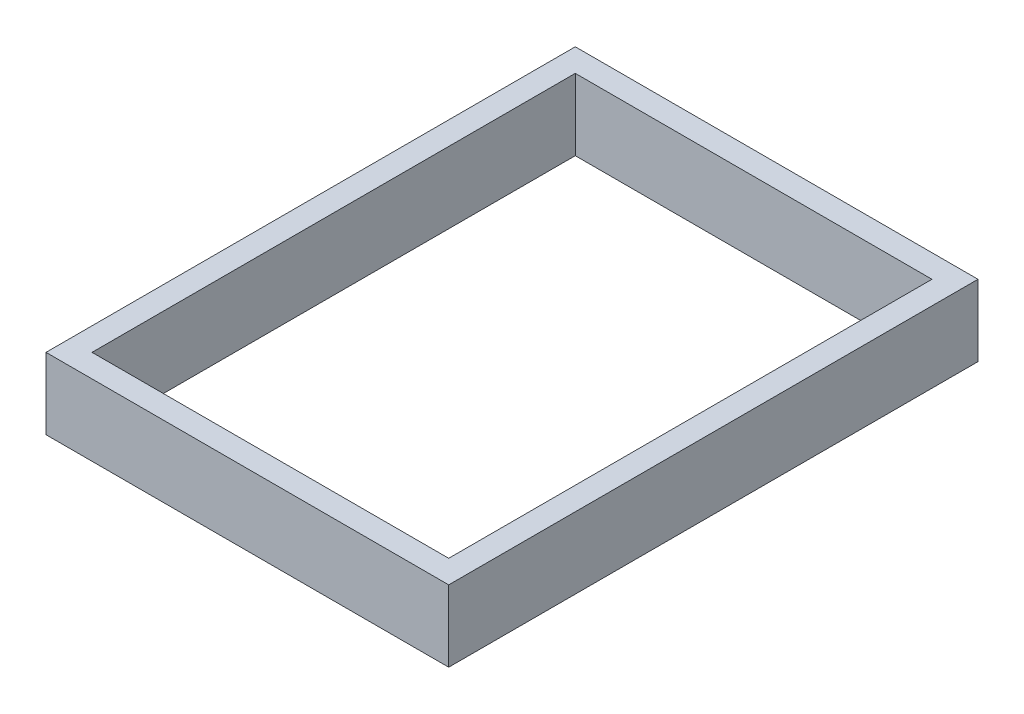
ISO-10303-21;
HEADER;
FILE_DESCRIPTION(('STEP AP214'),'2;1');
FILE_NAME('part.step','',(''),(''),'','','');
FILE_SCHEMA(('AUTOMOTIVE_DESIGN { 1 0 10303 214 1 1 1 1 }'));
ENDSEC;
DATA;
#1=APPLICATION_CONTEXT('core data for automotive mechanical design processes');
#2=APPLICATION_PROTOCOL_DEFINITION('international standard','automotive_design',2000,#1);
#3=PRODUCT_CONTEXT('',#1,'mechanical');
#4=PRODUCT('Part','Part','',(#3));
#5=PRODUCT_RELATED_PRODUCT_CATEGORY('part','',(#4));
#6=PRODUCT_DEFINITION_FORMATION('','',#4);
#7=PRODUCT_DEFINITION_CONTEXT('part definition',#1,'design');
#8=PRODUCT_DEFINITION('design','',#6,#7);
#9=PRODUCT_DEFINITION_SHAPE('','',#8);
#10=(LENGTH_UNIT() NAMED_UNIT(*) SI_UNIT(.MILLI.,.METRE.));
#11=(NAMED_UNIT(*) PLANE_ANGLE_UNIT() SI_UNIT($,.RADIAN.));
#12=(NAMED_UNIT(*) SI_UNIT($,.STERADIAN.) SOLID_ANGLE_UNIT());
#13=UNCERTAINTY_MEASURE_WITH_UNIT(LENGTH_MEASURE(1.E-05),#10,'distance_accuracy_value','');
#14=(GEOMETRIC_REPRESENTATION_CONTEXT(3) GLOBAL_UNCERTAINTY_ASSIGNED_CONTEXT((#13)) GLOBAL_UNIT_ASSIGNED_CONTEXT((#10,
#11,#12)) REPRESENTATION_CONTEXT('',''));
#15=CARTESIAN_POINT('',(0.,0.,0.));
#16=DIRECTION('',(0.,0.,1.));
#17=DIRECTION('',(1.,0.,0.));
#18=AXIS2_PLACEMENT_3D('',#15,#16,#17);
#19=CARTESIAN_POINT('',(0.,62.,-20.));
#20=DIRECTION('',(0.,0.,-1.));
#21=DIRECTION('',(-1.,0.,0.));
#22=AXIS2_PLACEMENT_3D('',#19,#20,#21);
#23=PLANE('',#22);
#24=DIRECTION('',(1.,0.,0.));
#25=VECTOR('',#24,1.);
#26=CARTESIAN_POINT('',(0.,0.,-20.));
#27=LINE('',#26,#25);
#28=CARTESIAN_POINT('',(20.,0.,-20.));
#29=VERTEX_POINT('',#28);
#30=CARTESIAN_POINT('',(330.,0.,-20.));
#31=VERTEX_POINT('',#30);
#32=EDGE_CURVE('E149',#29,#31,#27,.T.);
#33=ORIENTED_EDGE('',*,*,#32,.F.);
#34=DIRECTION('',(0.,-1.,0.));
#35=VECTOR('',#34,1.);
#36=CARTESIAN_POINT('',(20.,62.,-20.));
#37=LINE('',#36,#35);
#38=CARTESIAN_POINT('',(20.,62.,-20.));
#39=VERTEX_POINT('',#38);
#40=EDGE_CURVE('E11',#39,#29,#37,.T.);
#41=ORIENTED_EDGE('',*,*,#40,.F.);
#42=DIRECTION('',(1.,0.,0.));
#43=VECTOR('',#42,1.);
#44=CARTESIAN_POINT('',(0.,62.,-20.));
#45=LINE('',#44,#43);
#46=CARTESIAN_POINT('',(330.,62.,-20.));
#47=VERTEX_POINT('',#46);
#48=EDGE_CURVE('E122',#39,#47,#45,.T.);
#49=ORIENTED_EDGE('',*,*,#48,.T.);
#50=DIRECTION('',(0.,-1.,0.));
#51=VECTOR('',#50,1.);
#52=CARTESIAN_POINT('',(330.,62.,-20.));
#53=LINE('',#52,#51);
#54=EDGE_CURVE('E88',#47,#31,#53,.T.);
#55=ORIENTED_EDGE('',*,*,#54,.T.);
#56=EDGE_LOOP('',(#33,#41,#49,#55));
#57=FACE_BOUND('',#56,.T.);
#58=ADVANCED_FACE('F35',(#57),#23,.T.);
#59=CARTESIAN_POINT('',(20.,62.,0.));
#60=DIRECTION('',(-1.,0.,0.));
#61=DIRECTION('',(0.,0.,1.));
#62=AXIS2_PLACEMENT_3D('',#59,#60,#61);
#63=PLANE('',#62);
#64=DIRECTION('',(0.,0.,-1.));
#65=VECTOR('',#64,1.);
#66=CARTESIAN_POINT('',(20.,0.,0.));
#67=LINE('',#66,#65);
#68=CARTESIAN_POINT('',(20.,0.,-440.));
#69=VERTEX_POINT('',#68);
#70=EDGE_CURVE('E127',#29,#69,#67,.T.);
#71=ORIENTED_EDGE('',*,*,#70,.T.);
#72=DIRECTION('',(0.,-1.,0.));
#73=VECTOR('',#72,1.);
#74=CARTESIAN_POINT('',(20.,62.,-440.));
#75=LINE('',#74,#73);
#76=CARTESIAN_POINT('',(20.,62.,-440.));
#77=VERTEX_POINT('',#76);
#78=EDGE_CURVE('E45',#77,#69,#75,.T.);
#79=ORIENTED_EDGE('',*,*,#78,.F.);
#80=DIRECTION('',(0.,0.,-1.));
#81=VECTOR('',#80,1.);
#82=CARTESIAN_POINT('',(20.,62.,0.));
#83=LINE('',#82,#81);
#84=EDGE_CURVE('E118',#39,#77,#83,.T.);
#85=ORIENTED_EDGE('',*,*,#84,.F.);
#86=ORIENTED_EDGE('',*,*,#40,.T.);
#87=EDGE_LOOP('',(#71,#79,#85,#86));
#88=FACE_BOUND('',#87,.T.);
#89=ADVANCED_FACE('F125',(#88),#63,.F.);
#90=CARTESIAN_POINT('',(0.,62.,-440.));
#91=DIRECTION('',(0.,0.,-1.));
#92=DIRECTION('',(-1.,0.,0.));
#93=AXIS2_PLACEMENT_3D('',#90,#91,#92);
#94=PLANE('',#93);
#95=DIRECTION('',(1.,0.,0.));
#96=VECTOR('',#95,1.);
#97=CARTESIAN_POINT('',(0.,0.,-440.));
#98=LINE('',#97,#96);
#99=CARTESIAN_POINT('',(330.,0.,-440.));
#100=VERTEX_POINT('',#99);
#101=EDGE_CURVE('E146',#69,#100,#98,.T.);
#102=ORIENTED_EDGE('',*,*,#101,.T.);
#103=DIRECTION('',(0.,-1.,0.));
#104=VECTOR('',#103,1.);
#105=CARTESIAN_POINT('',(330.,62.,-440.));
#106=LINE('',#105,#104);
#107=CARTESIAN_POINT('',(330.,62.,-440.));
#108=VERTEX_POINT('',#107);
#109=EDGE_CURVE('E117',#108,#100,#106,.T.);
#110=ORIENTED_EDGE('',*,*,#109,.F.);
#111=DIRECTION('',(1.,0.,0.));
#112=VECTOR('',#111,1.);
#113=CARTESIAN_POINT('',(0.,62.,-440.));
#114=LINE('',#113,#112);
#115=EDGE_CURVE('E111',#77,#108,#114,.T.);
#116=ORIENTED_EDGE('',*,*,#115,.F.);
#117=ORIENTED_EDGE('',*,*,#78,.T.);
#118=EDGE_LOOP('',(#102,#110,#116,#117));
#119=FACE_BOUND('',#118,.T.);
#120=ADVANCED_FACE('F114',(#119),#94,.F.);
#121=CARTESIAN_POINT('',(0.,62.,-460.));
#122=DIRECTION('',(0.,0.,-1.));
#123=DIRECTION('',(-1.,0.,0.));
#124=AXIS2_PLACEMENT_3D('',#121,#122,#123);
#125=PLANE('',#124);
#126=DIRECTION('',(1.,0.,0.));
#127=VECTOR('',#126,1.);
#128=CARTESIAN_POINT('',(0.,0.,-460.));
#129=LINE('',#128,#127);
#130=CARTESIAN_POINT('',(0.,0.,-460.));
#131=VERTEX_POINT('',#130);
#132=CARTESIAN_POINT('',(350.,0.,-460.));
#133=VERTEX_POINT('',#132);
#134=EDGE_CURVE('E159',#131,#133,#129,.T.);
#135=ORIENTED_EDGE('',*,*,#134,.F.);
#136=DIRECTION('',(0.,-1.,0.));
#137=VECTOR('',#136,1.);
#138=CARTESIAN_POINT('',(0.,62.,-460.));
#139=LINE('',#138,#137);
#140=CARTESIAN_POINT('',(0.,62.,-460.));
#141=VERTEX_POINT('',#140);
#142=EDGE_CURVE('E39',#141,#131,#139,.T.);
#143=ORIENTED_EDGE('',*,*,#142,.F.);
#144=DIRECTION('',(1.,0.,0.));
#145=VECTOR('',#144,1.);
#146=CARTESIAN_POINT('',(0.,62.,-460.));
#147=LINE('',#146,#145);
#148=CARTESIAN_POINT('',(350.,62.,-460.));
#149=VERTEX_POINT('',#148);
#150=EDGE_CURVE('E145',#141,#149,#147,.T.);
#151=ORIENTED_EDGE('',*,*,#150,.T.);
#152=DIRECTION('',(0.,-1.,0.));
#153=VECTOR('',#152,1.);
#154=CARTESIAN_POINT('',(350.,62.,-460.));
#155=LINE('',#154,#153);
#156=EDGE_CURVE('E132',#149,#133,#155,.T.);
#157=ORIENTED_EDGE('',*,*,#156,.T.);
#158=EDGE_LOOP('',(#135,#143,#151,#157));
#159=FACE_BOUND('',#158,.T.);
#160=ADVANCED_FACE('F37',(#159),#125,.T.);
#161=CARTESIAN_POINT('',(0.,62.,0.));
#162=DIRECTION('',(-1.,0.,0.));
#163=DIRECTION('',(0.,0.,1.));
#164=AXIS2_PLACEMENT_3D('',#161,#162,#163);
#165=PLANE('',#164);
#166=DIRECTION('',(0.,0.,-1.));
#167=VECTOR('',#166,1.);
#168=CARTESIAN_POINT('',(0.,0.,0.));
#169=LINE('',#168,#167);
#170=CARTESIAN_POINT('',(0.,0.,0.));
#171=VERTEX_POINT('',#170);
#172=EDGE_CURVE('E156',#171,#131,#169,.T.);
#173=ORIENTED_EDGE('',*,*,#172,.F.);
#174=DIRECTION('',(0.,-1.,0.));
#175=VECTOR('',#174,1.);
#176=CARTESIAN_POINT('',(0.,62.,0.));
#177=LINE('',#176,#175);
#178=CARTESIAN_POINT('',(0.,62.,0.));
#179=VERTEX_POINT('',#178);
#180=EDGE_CURVE('E135',#179,#171,#177,.T.);
#181=ORIENTED_EDGE('',*,*,#180,.F.);
#182=DIRECTION('',(0.,0.,-1.));
#183=VECTOR('',#182,1.);
#184=CARTESIAN_POINT('',(0.,62.,0.));
#185=LINE('',#184,#183);
#186=EDGE_CURVE('E169',#179,#141,#185,.T.);
#187=ORIENTED_EDGE('',*,*,#186,.T.);
#188=ORIENTED_EDGE('',*,*,#142,.T.);
#189=EDGE_LOOP('',(#173,#181,#187,#188));
#190=FACE_BOUND('',#189,.T.);
#191=ADVANCED_FACE('F180',(#190),#165,.T.);
#192=CARTESIAN_POINT('',(0.,62.,0.));
#193=DIRECTION('',(0.,0.,-1.));
#194=DIRECTION('',(-1.,0.,0.));
#195=AXIS2_PLACEMENT_3D('',#192,#193,#194);
#196=PLANE('',#195);
#197=DIRECTION('',(1.,0.,0.));
#198=VECTOR('',#197,1.);
#199=CARTESIAN_POINT('',(0.,0.,0.));
#200=LINE('',#199,#198);
#201=CARTESIAN_POINT('',(350.,0.,0.));
#202=VERTEX_POINT('',#201);
#203=EDGE_CURVE('E154',#171,#202,#200,.T.);
#204=ORIENTED_EDGE('',*,*,#203,.T.);
#205=DIRECTION('',(0.,-1.,0.));
#206=VECTOR('',#205,1.);
#207=CARTESIAN_POINT('',(350.,62.,0.));
#208=LINE('',#207,#206);
#209=CARTESIAN_POINT('',(350.,62.,0.));
#210=VERTEX_POINT('',#209);
#211=EDGE_CURVE('E134',#210,#202,#208,.T.);
#212=ORIENTED_EDGE('',*,*,#211,.F.);
#213=DIRECTION('',(1.,0.,0.));
#214=VECTOR('',#213,1.);
#215=CARTESIAN_POINT('',(0.,62.,0.));
#216=LINE('',#215,#214);
#217=EDGE_CURVE('E167',#179,#210,#216,.T.);
#218=ORIENTED_EDGE('',*,*,#217,.F.);
#219=ORIENTED_EDGE('',*,*,#180,.T.);
#220=EDGE_LOOP('',(#204,#212,#218,#219));
#221=FACE_BOUND('',#220,.T.);
#222=ADVANCED_FACE('F181',(#221),#196,.F.);
#223=CARTESIAN_POINT('',(350.,62.,0.));
#224=DIRECTION('',(1.,0.,0.));
#225=DIRECTION('',(0.,0.,-1.));
#226=AXIS2_PLACEMENT_3D('',#223,#224,#225);
#227=PLANE('',#226);
#228=DIRECTION('',(0.,0.,1.));
#229=VECTOR('',#228,1.);
#230=CARTESIAN_POINT('',(350.,0.,0.));
#231=LINE('',#230,#229);
#232=EDGE_CURVE('E151',#133,#202,#231,.T.);
#233=ORIENTED_EDGE('',*,*,#232,.F.);
#234=ORIENTED_EDGE('',*,*,#156,.F.);
#235=DIRECTION('',(0.,0.,1.));
#236=VECTOR('',#235,1.);
#237=CARTESIAN_POINT('',(350.,62.,0.));
#238=LINE('',#237,#236);
#239=EDGE_CURVE('E164',#149,#210,#238,.T.);
#240=ORIENTED_EDGE('',*,*,#239,.T.);
#241=ORIENTED_EDGE('',*,*,#211,.T.);
#242=EDGE_LOOP('',(#233,#234,#240,#241));
#243=FACE_BOUND('',#242,.T.);
#244=ADVANCED_FACE('F177',(#243),#227,.T.);
#245=CARTESIAN_POINT('',(330.,62.,0.));
#246=DIRECTION('',(1.,0.,0.));
#247=DIRECTION('',(0.,0.,-1.));
#248=AXIS2_PLACEMENT_3D('',#245,#246,#247);
#249=PLANE('',#248);
#250=DIRECTION('',(0.,0.,1.));
#251=VECTOR('',#250,1.);
#252=CARTESIAN_POINT('',(330.,0.,0.));
#253=LINE('',#252,#251);
#254=EDGE_CURVE('E81',#100,#31,#253,.T.);
#255=ORIENTED_EDGE('',*,*,#254,.T.);
#256=ORIENTED_EDGE('',*,*,#54,.F.);
#257=DIRECTION('',(0.,0.,1.));
#258=VECTOR('',#257,1.);
#259=CARTESIAN_POINT('',(330.,62.,0.));
#260=LINE('',#259,#258);
#261=EDGE_CURVE('E54',#108,#47,#260,.T.);
#262=ORIENTED_EDGE('',*,*,#261,.F.);
#263=ORIENTED_EDGE('',*,*,#109,.T.);
#264=EDGE_LOOP('',(#255,#256,#262,#263));
#265=FACE_BOUND('',#264,.T.);
#266=ADVANCED_FACE('F188',(#265),#249,.F.);
#267=CARTESIAN_POINT('',(0.,62.,0.));
#268=DIRECTION('',(0.,1.,0.));
#269=DIRECTION('',(0.,0.,1.));
#270=AXIS2_PLACEMENT_3D('',#267,#268,#269);
#271=PLANE('',#270);
#272=ORIENTED_EDGE('',*,*,#150,.F.);
#273=ORIENTED_EDGE('',*,*,#186,.F.);
#274=ORIENTED_EDGE('',*,*,#217,.T.);
#275=ORIENTED_EDGE('',*,*,#239,.F.);
#276=EDGE_LOOP('',(#272,#273,#274,#275));
#277=FACE_BOUND('',#276,.T.);
#278=ORIENTED_EDGE('',*,*,#48,.F.);
#279=ORIENTED_EDGE('',*,*,#84,.T.);
#280=ORIENTED_EDGE('',*,*,#115,.T.);
#281=ORIENTED_EDGE('',*,*,#261,.T.);
#282=EDGE_LOOP('',(#278,#279,#280,#281));
#283=FACE_BOUND('',#282,.T.);
#284=ADVANCED_FACE('F121',(#277,#283),#271,.T.);
#285=CARTESIAN_POINT('',(0.,0.,0.));
#286=DIRECTION('',(0.,1.,0.));
#287=DIRECTION('',(0.,0.,1.));
#288=AXIS2_PLACEMENT_3D('',#285,#286,#287);
#289=PLANE('',#288);
#290=ORIENTED_EDGE('',*,*,#134,.T.);
#291=ORIENTED_EDGE('',*,*,#232,.T.);
#292=ORIENTED_EDGE('',*,*,#203,.F.);
#293=ORIENTED_EDGE('',*,*,#172,.T.);
#294=EDGE_LOOP('',(#290,#291,#292,#293));
#295=FACE_BOUND('',#294,.T.);
#296=ORIENTED_EDGE('',*,*,#32,.T.);
#297=ORIENTED_EDGE('',*,*,#254,.F.);
#298=ORIENTED_EDGE('',*,*,#101,.F.);
#299=ORIENTED_EDGE('',*,*,#70,.F.);
#300=EDGE_LOOP('',(#296,#297,#298,#299));
#301=FACE_BOUND('',#300,.T.);
#302=ADVANCED_FACE('F179',(#295,#301),#289,.F.);
#303=CLOSED_SHELL('',(#58,#89,#120,#160,#191,#222,#244,#266,#284,#302));
#304=MANIFOLD_SOLID_BREP('B2',#303);
#305=ADVANCED_BREP_SHAPE_REPRESENTATION('',(#18,#304),#14);
#306=SHAPE_DEFINITION_REPRESENTATION(#9,#305);
ENDSEC;
END-ISO-10303-21;
